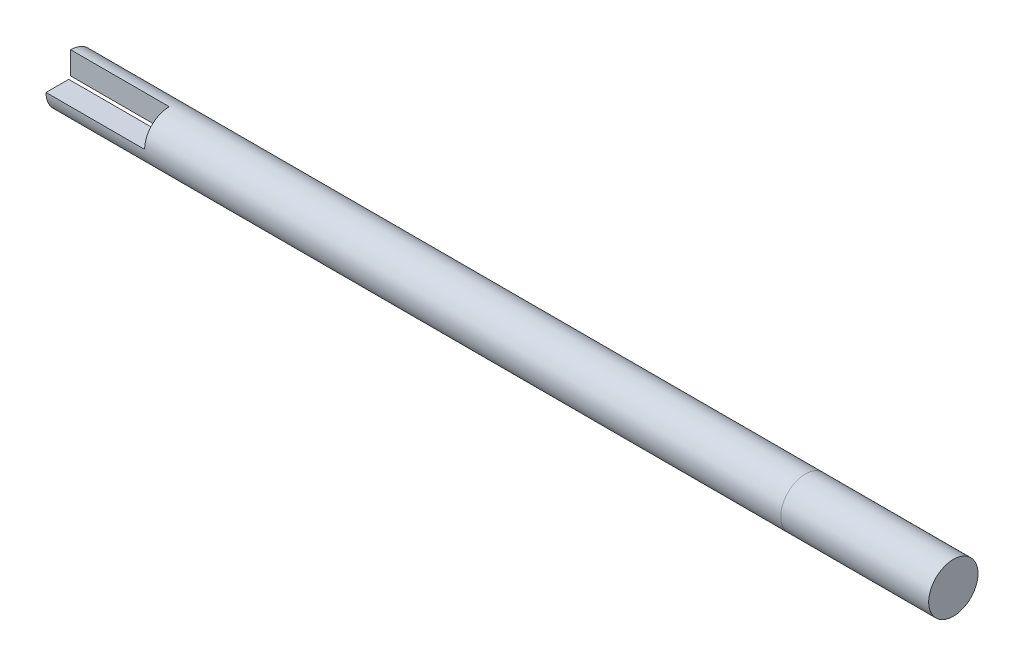
ISO-10303-21;
HEADER;
FILE_DESCRIPTION(('STEP AP214'),'2;1');
FILE_NAME('part.step','',(''),(''),'','','');
FILE_SCHEMA(('AUTOMOTIVE_DESIGN { 1 0 10303 214 1 1 1 1 }'));
ENDSEC;
DATA;
#1=APPLICATION_CONTEXT('core data for automotive mechanical design processes');
#2=APPLICATION_PROTOCOL_DEFINITION('international standard','automotive_design',2000,#1);
#3=PRODUCT_CONTEXT('',#1,'mechanical');
#4=PRODUCT('Part','Part','',(#3));
#5=PRODUCT_RELATED_PRODUCT_CATEGORY('part','',(#4));
#6=PRODUCT_DEFINITION_FORMATION('','',#4);
#7=PRODUCT_DEFINITION_CONTEXT('part definition',#1,'design');
#8=PRODUCT_DEFINITION('design','',#6,#7);
#9=PRODUCT_DEFINITION_SHAPE('','',#8);
#10=(LENGTH_UNIT() NAMED_UNIT(*) SI_UNIT(.MILLI.,.METRE.));
#11=(NAMED_UNIT(*) PLANE_ANGLE_UNIT() SI_UNIT($,.RADIAN.));
#12=(NAMED_UNIT(*) SI_UNIT($,.STERADIAN.) SOLID_ANGLE_UNIT());
#13=UNCERTAINTY_MEASURE_WITH_UNIT(LENGTH_MEASURE(1.E-05),#10,'distance_accuracy_value','');
#14=(GEOMETRIC_REPRESENTATION_CONTEXT(3) GLOBAL_UNCERTAINTY_ASSIGNED_CONTEXT((#13)) GLOBAL_UNIT_ASSIGNED_CONTEXT((#10,
#11,#12)) REPRESENTATION_CONTEXT('',''));
#15=CARTESIAN_POINT('',(0.,0.,0.));
#16=DIRECTION('',(0.,0.,1.));
#17=DIRECTION('',(1.,0.,0.));
#18=AXIS2_PLACEMENT_3D('',#15,#16,#17);
#19=CARTESIAN_POINT('',(250.204561609067,0.,0.));
#20=DIRECTION('',(1.,0.,0.));
#21=DIRECTION('',(0.,0.,-1.));
#22=AXIS2_PLACEMENT_3D('',#19,#20,#21);
#23=PLANE('',#22);
#24=CARTESIAN_POINT('',(250.204561609067,0.,0.));
#25=DIRECTION('',(1.,0.,0.));
#26=DIRECTION('',(0.,0.,-1.));
#27=AXIS2_PLACEMENT_3D('',#24,#25,#26);
#28=CIRCLE('',#27,2.5);
#29=CARTESIAN_POINT('',(250.204561609067,0.,2.49999999999997));
#30=VERTEX_POINT('',#29);
#31=CARTESIAN_POINT('',(250.204561609067,-2.5,0.));
#32=VERTEX_POINT('',#31);
#33=EDGE_CURVE('E142',#30,#32,#28,.T.);
#34=ORIENTED_EDGE('',*,*,#33,.F.);
#35=DIRECTION('',(0.,0.,1.));
#36=VECTOR('',#35,1.);
#37=CARTESIAN_POINT('',(250.204561609067,0.,2.49999999999997));
#38=LINE('',#37,#36);
#39=CARTESIAN_POINT('',(250.204561609067,0.,0.194982329167226));
#40=VERTEX_POINT('',#39);
#41=EDGE_CURVE('E126',#40,#30,#38,.T.);
#42=ORIENTED_EDGE('',*,*,#41,.F.);
#43=CARTESIAN_POINT('',(250.204561609067,0.,0.));
#44=DIRECTION('',(-1.,0.,0.));
#45=DIRECTION('',(0.,0.,1.));
#46=AXIS2_PLACEMENT_3D('',#43,#44,#45);
#47=CIRCLE('',#46,0.194982329167258);
#48=CARTESIAN_POINT('',(250.204561609067,-0.194982329167258,0.));
#49=VERTEX_POINT('',#48);
#50=EDGE_CURVE('E198',#49,#40,#47,.T.);
#51=ORIENTED_EDGE('',*,*,#50,.F.);
#52=DIRECTION('',(0.,1.,0.));
#53=VECTOR('',#52,1.);
#54=CARTESIAN_POINT('',(250.204561609067,-2.5,0.));
#55=LINE('',#54,#53);
#56=EDGE_CURVE('E170',#32,#49,#55,.T.);
#57=ORIENTED_EDGE('',*,*,#56,.F.);
#58=EDGE_LOOP('',(#34,#42,#51,#57));
#59=FACE_BOUND('',#58,.T.);
#60=ADVANCED_FACE('F44',(#59),#23,.F.);
#61=CARTESIAN_POINT('',(250.204561609067,0.,-2.50000000000003));
#62=VERTEX_POINT('',#61);
#63=CARTESIAN_POINT('',(250.204561609067,2.5,0.));
#64=VERTEX_POINT('',#63);
#65=EDGE_CURVE('E134',#62,#64,#28,.T.);
#66=ORIENTED_EDGE('',*,*,#65,.F.);
#67=DIRECTION('',(0.,0.,-1.));
#68=VECTOR('',#67,1.);
#69=CARTESIAN_POINT('',(250.204561609067,0.,-0.19498232916729));
#70=LINE('',#69,#68);
#71=CARTESIAN_POINT('',(250.204561609067,0.,-0.19498232916729));
#72=VERTEX_POINT('',#71);
#73=EDGE_CURVE('E188',#72,#62,#70,.T.);
#74=ORIENTED_EDGE('',*,*,#73,.F.);
#75=CARTESIAN_POINT('',(250.204561609067,0.,0.));
#76=DIRECTION('',(-1.,0.,0.));
#77=DIRECTION('',(0.,0.,1.));
#78=AXIS2_PLACEMENT_3D('',#75,#76,#77);
#79=CIRCLE('',#78,0.194982329167258);
#80=CARTESIAN_POINT('',(250.204561609067,0.194982329167258,0.));
#81=VERTEX_POINT('',#80);
#82=EDGE_CURVE('E193',#81,#72,#79,.T.);
#83=ORIENTED_EDGE('',*,*,#82,.F.);
#84=DIRECTION('',(0.,-1.,0.));
#85=VECTOR('',#84,1.);
#86=CARTESIAN_POINT('',(250.204561609067,0.194982329167258,0.));
#87=LINE('',#86,#85);
#88=EDGE_CURVE('E195',#64,#81,#87,.T.);
#89=ORIENTED_EDGE('',*,*,#88,.F.);
#90=EDGE_LOOP('',(#66,#74,#83,#89));
#91=FACE_BOUND('',#90,.T.);
#92=ADVANCED_FACE('F46',(#91),#23,.F.);
#93=CARTESIAN_POINT('',(339.702814789067,0.,-1.42115178302208E-13));
#94=DIRECTION('',(1.,0.,0.));
#95=DIRECTION('',(0.,0.,-1.));
#96=AXIS2_PLACEMENT_3D('',#93,#94,#95);
#97=PLANE('',#96);
#98=CARTESIAN_POINT('',(339.702814789067,0.,-1.42115178302208E-13));
#99=DIRECTION('',(1.,0.,0.));
#100=DIRECTION('',(0.,0.,-1.));
#101=AXIS2_PLACEMENT_3D('',#98,#99,#100);
#102=CIRCLE('',#101,2.5);
#103=CARTESIAN_POINT('',(339.702814789067,0.,-2.50000000000014));
#104=VERTEX_POINT('',#103);
#105=EDGE_CURVE('E12',#104,#104,#102,.T.);
#106=ORIENTED_EDGE('',*,*,#105,.T.);
#107=EDGE_LOOP('',(#106));
#108=FACE_BOUND('',#107,.T.);
#109=ADVANCED_FACE('F148',(#108),#97,.T.);
#110=CARTESIAN_POINT('',(250.204561609067,0.,0.));
#111=DIRECTION('',(1.,0.,0.));
#112=DIRECTION('',(0.,0.,-1.));
#113=AXIS2_PLACEMENT_3D('',#110,#111,#112);
#114=CYLINDRICAL_SURFACE('',#113,2.5);
#115=DIRECTION('',(-1.,0.,0.));
#116=VECTOR('',#115,1.);
#117=CARTESIAN_POINT('',(260.204561609067,-2.5,0.));
#118=LINE('',#117,#116);
#119=CARTESIAN_POINT('',(260.204561609067,-2.5,0.));
#120=VERTEX_POINT('',#119);
#121=EDGE_CURVE('E180',#120,#32,#118,.T.);
#122=ORIENTED_EDGE('',*,*,#121,.F.);
#123=CARTESIAN_POINT('',(260.204561609067,0.,0.));
#124=DIRECTION('',(-1.,0.,0.));
#125=DIRECTION('',(0.,0.,1.));
#126=AXIS2_PLACEMENT_3D('',#123,#124,#125);
#127=CIRCLE('',#126,2.5);
#128=CARTESIAN_POINT('',(260.204561609067,0.,-2.50000000000003));
#129=VERTEX_POINT('',#128);
#130=EDGE_CURVE('E210',#129,#120,#127,.T.);
#131=ORIENTED_EDGE('',*,*,#130,.F.);
#132=DIRECTION('',(-1.,0.,0.));
#133=VECTOR('',#132,1.);
#134=CARTESIAN_POINT('',(260.204561609067,0.,-2.50000000000003));
#135=LINE('',#134,#133);
#136=EDGE_CURVE('E182',#129,#62,#135,.T.);
#137=ORIENTED_EDGE('',*,*,#136,.T.);
#138=ORIENTED_EDGE('',*,*,#65,.T.);
#139=DIRECTION('',(-1.,0.,0.));
#140=VECTOR('',#139,1.);
#141=CARTESIAN_POINT('',(260.204561609067,2.5,0.));
#142=LINE('',#141,#140);
#143=CARTESIAN_POINT('',(260.204561609067,2.5,0.));
#144=VERTEX_POINT('',#143);
#145=EDGE_CURVE('E114',#144,#64,#142,.T.);
#146=ORIENTED_EDGE('',*,*,#145,.F.);
#147=CARTESIAN_POINT('',(260.204561609067,0.,0.));
#148=DIRECTION('',(-1.,0.,0.));
#149=DIRECTION('',(0.,0.,1.));
#150=AXIS2_PLACEMENT_3D('',#147,#148,#149);
#151=CIRCLE('',#150,2.5);
#152=CARTESIAN_POINT('',(260.204561609067,0.,2.5));
#153=VERTEX_POINT('',#152);
#154=EDGE_CURVE('E120',#153,#144,#151,.T.);
#155=ORIENTED_EDGE('',*,*,#154,.F.);
#156=DIRECTION('',(-1.,0.,0.));
#157=VECTOR('',#156,1.);
#158=CARTESIAN_POINT('',(260.204561609067,0.,2.49999999999997));
#159=LINE('',#158,#157);
#160=EDGE_CURVE('E171',#153,#30,#159,.T.);
#161=ORIENTED_EDGE('',*,*,#160,.T.);
#162=ORIENTED_EDGE('',*,*,#33,.T.);
#163=EDGE_LOOP('',(#122,#131,#137,#138,#146,#155,#161,#162));
#164=FACE_BOUND('',#163,.T.);
#165=CARTESIAN_POINT('',(324.702814789067,0.,0.));
#166=DIRECTION('',(1.,0.,0.));
#167=DIRECTION('',(0.,0.,-1.));
#168=AXIS2_PLACEMENT_3D('',#165,#166,#167);
#169=CIRCLE('',#168,2.5);
#170=CARTESIAN_POINT('',(324.702814789067,0.,-2.50000000000001));
#171=VERTEX_POINT('',#170);
#172=EDGE_CURVE('E52',#171,#171,#169,.T.);
#173=ORIENTED_EDGE('',*,*,#172,.F.);
#174=EDGE_LOOP('',(#173));
#175=FACE_BOUND('',#174,.T.);
#176=ADVANCED_FACE('F130',(#164,#175),#114,.T.);
#177=CARTESIAN_POINT('',(324.702814789067,0.,-1.48771054755584E-13));
#178=DIRECTION('',(1.,0.,0.));
#179=DIRECTION('',(0.,0.,-1.));
#180=AXIS2_PLACEMENT_3D('',#177,#178,#179);
#181=CYLINDRICAL_SURFACE('',#180,2.5);
#182=ORIENTED_EDGE('',*,*,#105,.F.);
#183=EDGE_LOOP('',(#182));
#184=FACE_BOUND('',#183,.T.);
#185=ORIENTED_EDGE('',*,*,#172,.T.);
#186=EDGE_LOOP('',(#185));
#187=FACE_BOUND('',#186,.T.);
#188=ADVANCED_FACE('F146',(#184,#187),#181,.T.);
#189=CARTESIAN_POINT('',(260.204561609067,0.,2.49999999999997));
#190=DIRECTION('',(0.,-1.,0.));
#191=DIRECTION('',(0.,0.,-1.));
#192=AXIS2_PLACEMENT_3D('',#189,#190,#191);
#193=PLANE('',#192);
#194=ORIENTED_EDGE('',*,*,#41,.T.);
#195=ORIENTED_EDGE('',*,*,#160,.F.);
#196=DIRECTION('',(0.,0.,1.));
#197=VECTOR('',#196,1.);
#198=CARTESIAN_POINT('',(260.204561609067,0.,2.49999999999997));
#199=LINE('',#198,#197);
#200=CARTESIAN_POINT('',(260.204561609067,0.,0.194982329167224));
#201=VERTEX_POINT('',#200);
#202=EDGE_CURVE('E59',#201,#153,#199,.T.);
#203=ORIENTED_EDGE('',*,*,#202,.F.);
#204=DIRECTION('',(-1.,0.,0.));
#205=VECTOR('',#204,1.);
#206=CARTESIAN_POINT('',(260.204561609067,0.,0.194982329167224));
#207=LINE('',#206,#205);
#208=EDGE_CURVE('E172',#201,#40,#207,.T.);
#209=ORIENTED_EDGE('',*,*,#208,.T.);
#210=EDGE_LOOP('',(#194,#195,#203,#209));
#211=FACE_BOUND('',#210,.T.);
#212=ADVANCED_FACE('F154',(#211),#193,.F.);
#213=CARTESIAN_POINT('',(260.204561609067,0.,0.));
#214=DIRECTION('',(-1.,0.,0.));
#215=DIRECTION('',(0.,0.,1.));
#216=AXIS2_PLACEMENT_3D('',#213,#214,#215);
#217=CYLINDRICAL_SURFACE('',#216,0.194982329167258);
#218=ORIENTED_EDGE('',*,*,#50,.T.);
#219=ORIENTED_EDGE('',*,*,#208,.F.);
#220=CARTESIAN_POINT('',(260.204561609067,0.,0.));
#221=DIRECTION('',(-1.,0.,0.));
#222=DIRECTION('',(0.,0.,1.));
#223=AXIS2_PLACEMENT_3D('',#220,#221,#222);
#224=CIRCLE('',#223,0.194982329167258);
#225=CARTESIAN_POINT('',(260.204561609067,-0.194982329167258,0.));
#226=VERTEX_POINT('',#225);
#227=EDGE_CURVE('E138',#226,#201,#224,.T.);
#228=ORIENTED_EDGE('',*,*,#227,.F.);
#229=DIRECTION('',(-1.,0.,0.));
#230=VECTOR('',#229,1.);
#231=CARTESIAN_POINT('',(260.204561609067,-0.194982329167258,0.));
#232=LINE('',#231,#230);
#233=EDGE_CURVE('E174',#226,#49,#232,.T.);
#234=ORIENTED_EDGE('',*,*,#233,.T.);
#235=EDGE_LOOP('',(#218,#219,#228,#234));
#236=FACE_BOUND('',#235,.T.);
#237=ADVANCED_FACE('F205',(#236),#217,.F.);
#238=CARTESIAN_POINT('',(260.204561609067,-2.5,0.));
#239=DIRECTION('',(0.,0.,1.));
#240=DIRECTION('',(0.,-1.,0.));
#241=AXIS2_PLACEMENT_3D('',#238,#239,#240);
#242=PLANE('',#241);
#243=ORIENTED_EDGE('',*,*,#56,.T.);
#244=ORIENTED_EDGE('',*,*,#233,.F.);
#245=DIRECTION('',(0.,1.,0.));
#246=VECTOR('',#245,1.);
#247=CARTESIAN_POINT('',(260.204561609067,-2.5,0.));
#248=LINE('',#247,#246);
#249=EDGE_CURVE('E208',#120,#226,#248,.T.);
#250=ORIENTED_EDGE('',*,*,#249,.F.);
#251=ORIENTED_EDGE('',*,*,#121,.T.);
#252=EDGE_LOOP('',(#243,#244,#250,#251));
#253=FACE_BOUND('',#252,.T.);
#254=ADVANCED_FACE('F217',(#253),#242,.F.);
#255=CARTESIAN_POINT('',(260.204561609067,0.,-0.194982329167292));
#256=DIRECTION('',(0.,1.,0.));
#257=DIRECTION('',(0.,0.,1.));
#258=AXIS2_PLACEMENT_3D('',#255,#256,#257);
#259=PLANE('',#258);
#260=ORIENTED_EDGE('',*,*,#73,.T.);
#261=ORIENTED_EDGE('',*,*,#136,.F.);
#262=DIRECTION('',(0.,0.,-1.));
#263=VECTOR('',#262,1.);
#264=CARTESIAN_POINT('',(260.204561609067,0.,-0.194982329167292));
#265=LINE('',#264,#263);
#266=CARTESIAN_POINT('',(260.204561609067,0.,-0.194982329167292));
#267=VERTEX_POINT('',#266);
#268=EDGE_CURVE('E190',#267,#129,#265,.T.);
#269=ORIENTED_EDGE('',*,*,#268,.F.);
#270=DIRECTION('',(-1.,0.,0.));
#271=VECTOR('',#270,1.);
#272=CARTESIAN_POINT('',(260.204561609067,0.,-0.194982329167292));
#273=LINE('',#272,#271);
#274=EDGE_CURVE('E136',#267,#72,#273,.T.);
#275=ORIENTED_EDGE('',*,*,#274,.T.);
#276=EDGE_LOOP('',(#260,#261,#269,#275));
#277=FACE_BOUND('',#276,.T.);
#278=ADVANCED_FACE('F186',(#277),#259,.F.);
#279=CARTESIAN_POINT('',(260.204561609067,0.,0.));
#280=DIRECTION('',(-1.,0.,0.));
#281=DIRECTION('',(0.,0.,1.));
#282=AXIS2_PLACEMENT_3D('',#279,#280,#281);
#283=CYLINDRICAL_SURFACE('',#282,0.194982329167258);
#284=ORIENTED_EDGE('',*,*,#82,.T.);
#285=ORIENTED_EDGE('',*,*,#274,.F.);
#286=CARTESIAN_POINT('',(260.204561609067,0.,0.));
#287=DIRECTION('',(-1.,0.,0.));
#288=DIRECTION('',(0.,0.,1.));
#289=AXIS2_PLACEMENT_3D('',#286,#287,#288);
#290=CIRCLE('',#289,0.194982329167258);
#291=CARTESIAN_POINT('',(260.204561609067,0.194982329167258,0.));
#292=VERTEX_POINT('',#291);
#293=EDGE_CURVE('E119',#292,#267,#290,.T.);
#294=ORIENTED_EDGE('',*,*,#293,.F.);
#295=DIRECTION('',(-1.,0.,0.));
#296=VECTOR('',#295,1.);
#297=CARTESIAN_POINT('',(260.204561609067,0.194982329167258,0.));
#298=LINE('',#297,#296);
#299=EDGE_CURVE('E116',#292,#81,#298,.T.);
#300=ORIENTED_EDGE('',*,*,#299,.T.);
#301=EDGE_LOOP('',(#284,#285,#294,#300));
#302=FACE_BOUND('',#301,.T.);
#303=ADVANCED_FACE('F194',(#302),#283,.F.);
#304=CARTESIAN_POINT('',(260.204561609067,0.194982329167258,0.));
#305=DIRECTION('',(0.,0.,-1.));
#306=DIRECTION('',(0.,1.,0.));
#307=AXIS2_PLACEMENT_3D('',#304,#305,#306);
#308=PLANE('',#307);
#309=ORIENTED_EDGE('',*,*,#88,.T.);
#310=ORIENTED_EDGE('',*,*,#299,.F.);
#311=DIRECTION('',(0.,-1.,0.));
#312=VECTOR('',#311,1.);
#313=CARTESIAN_POINT('',(260.204561609067,0.194982329167258,0.));
#314=LINE('',#313,#312);
#315=EDGE_CURVE('E110',#144,#292,#314,.T.);
#316=ORIENTED_EDGE('',*,*,#315,.F.);
#317=ORIENTED_EDGE('',*,*,#145,.T.);
#318=EDGE_LOOP('',(#309,#310,#316,#317));
#319=FACE_BOUND('',#318,.T.);
#320=ADVANCED_FACE('F112',(#319),#308,.F.);
#321=CARTESIAN_POINT('',(260.204561609067,0.,0.));
#322=DIRECTION('',(-1.,0.,0.));
#323=DIRECTION('',(0.,0.,1.));
#324=AXIS2_PLACEMENT_3D('',#321,#322,#323);
#325=PLANE('',#324);
#326=ORIENTED_EDGE('',*,*,#154,.T.);
#327=ORIENTED_EDGE('',*,*,#315,.T.);
#328=ORIENTED_EDGE('',*,*,#293,.T.);
#329=ORIENTED_EDGE('',*,*,#268,.T.);
#330=ORIENTED_EDGE('',*,*,#130,.T.);
#331=ORIENTED_EDGE('',*,*,#249,.T.);
#332=ORIENTED_EDGE('',*,*,#227,.T.);
#333=ORIENTED_EDGE('',*,*,#202,.T.);
#334=EDGE_LOOP('',(#326,#327,#328,#329,#330,#331,#332,#333));
#335=FACE_BOUND('',#334,.T.);
#336=ADVANCED_FACE('F123',(#335),#325,.T.);
#337=CLOSED_SHELL('',(#60,#92,#109,#176,#188,#212,#237,#254,#278,#303,#320,#336));
#338=MANIFOLD_SOLID_BREP('B2',#337);
#339=ADVANCED_BREP_SHAPE_REPRESENTATION('',(#18,#338),#14);
#340=SHAPE_DEFINITION_REPRESENTATION(#9,#339);
ENDSEC;
END-ISO-10303-21;
